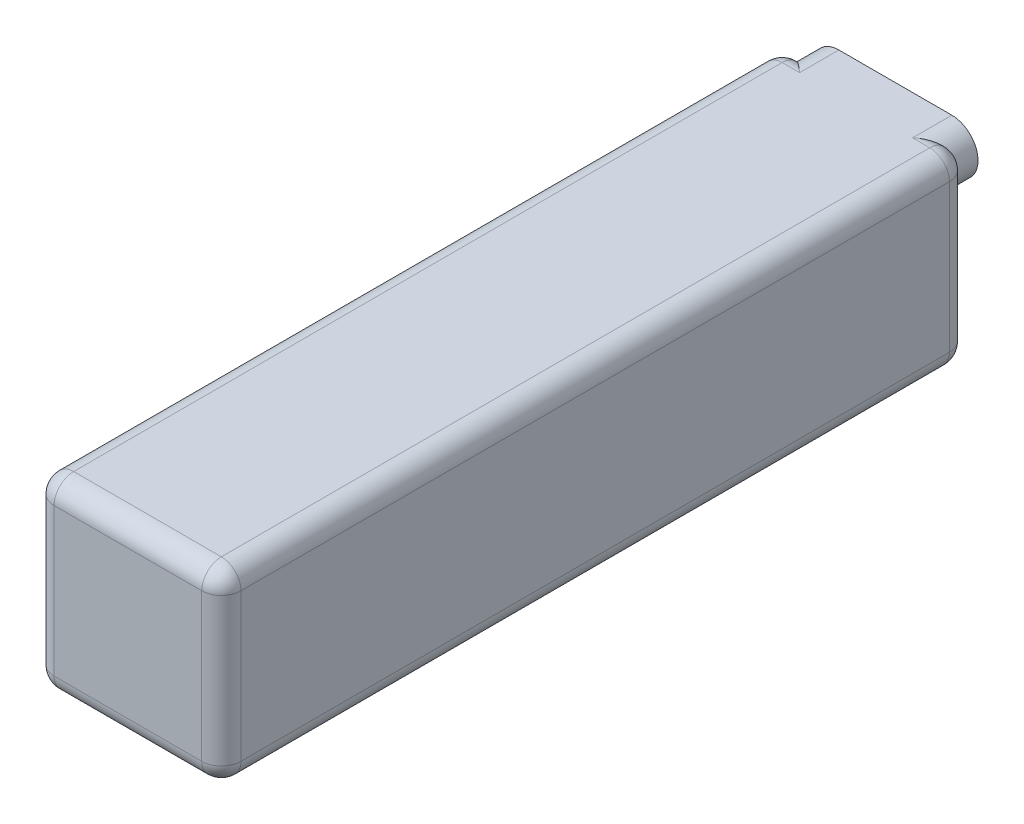
ISO-10303-21;
HEADER;
FILE_DESCRIPTION(('STEP AP214'),'2;1');
FILE_NAME('part.step','',(''),(''),'','','');
FILE_SCHEMA(('AUTOMOTIVE_DESIGN { 1 0 10303 214 1 1 1 1 }'));
ENDSEC;
DATA;
#1=APPLICATION_CONTEXT('core data for automotive mechanical design processes');
#2=APPLICATION_PROTOCOL_DEFINITION('international standard','automotive_design',2000,#1);
#3=PRODUCT_CONTEXT('',#1,'mechanical');
#4=PRODUCT('Part','Part','',(#3));
#5=PRODUCT_RELATED_PRODUCT_CATEGORY('part','',(#4));
#6=PRODUCT_DEFINITION_FORMATION('','',#4);
#7=PRODUCT_DEFINITION_CONTEXT('part definition',#1,'design');
#8=PRODUCT_DEFINITION('design','',#6,#7);
#9=PRODUCT_DEFINITION_SHAPE('','',#8);
#10=(LENGTH_UNIT() NAMED_UNIT(*) SI_UNIT(.MILLI.,.METRE.));
#11=(NAMED_UNIT(*) PLANE_ANGLE_UNIT() SI_UNIT($,.RADIAN.));
#12=(NAMED_UNIT(*) SI_UNIT($,.STERADIAN.) SOLID_ANGLE_UNIT());
#13=UNCERTAINTY_MEASURE_WITH_UNIT(LENGTH_MEASURE(1.E-05),#10,'distance_accuracy_value','');
#14=(GEOMETRIC_REPRESENTATION_CONTEXT(3) GLOBAL_UNCERTAINTY_ASSIGNED_CONTEXT((#13)) GLOBAL_UNIT_ASSIGNED_CONTEXT((#10,
#11,#12)) REPRESENTATION_CONTEXT('',''));
#15=CARTESIAN_POINT('',(0.,0.,0.));
#16=DIRECTION('',(0.,0.,1.));
#17=DIRECTION('',(1.,0.,0.));
#18=AXIS2_PLACEMENT_3D('',#15,#16,#17);
#19=CARTESIAN_POINT('',(9.525,7.525,-36.1));
#20=DIRECTION('',(-1.,0.,0.));
#21=DIRECTION('',(0.,0.,1.));
#22=AXIS2_PLACEMENT_3D('',#19,#20,#21);
#23=CYLINDRICAL_SURFACE('',#22,2.);
#24=CARTESIAN_POINT('',(7.525,8.8678567643771,-37.5821388971236));
#25=CARTESIAN_POINT('',(7.47017148830858,8.91566903286892,-37.5388018883186));
#26=CARTESIAN_POINT('',(7.4141431287502,8.96060289747981,-37.4938954286984));
#27=CARTESIAN_POINT('',(7.30014811470654,9.04486356532495,-37.4015113987563));
#28=CARTESIAN_POINT('',(7.24218355786483,9.08419620821077,-37.3540365784692));
#29=CARTESIAN_POINT('',(7.12470562884396,9.15747576152369,-37.2570275110353));
#30=CARTESIAN_POINT('',(7.06519347513015,9.19142676803975,-37.2074948667421));
#31=CARTESIAN_POINT('',(6.94487994390187,9.25416484822705,-37.1067325511129));
#32=CARTESIAN_POINT('',(6.88407807581614,9.28294991605546,-37.0555022297057));
#33=CARTESIAN_POINT('',(6.65375848806843,9.38170052472101,-36.8605363809341));
#34=CARTESIAN_POINT('',(6.48079000783268,9.43523660211648,-36.7123068380198));
#35=CARTESIAN_POINT('',(6.13170620049937,9.50660669497906,-36.4115740012556));
#36=CARTESIAN_POINT('',(5.95559399739287,9.52447435758405,-36.2590748729088));
#37=CARTESIAN_POINT('',(5.77710373823679,9.52499617982251,-36.1045075659285));
#38=CARTESIAN_POINT('',(5.7745011032655,9.52499998907685,-36.1022537587659));
#39=CARTESIAN_POINT('',(5.77189852356241,9.52500000000001,-36.1));
#40=B_SPLINE_CURVE_WITH_KNOTS('',3,(#24,#25,#26,#27,#28,#29,#30,#31,#32,#33,#34,#35,#36,#37,#38,
#39),.UNSPECIFIED.,.F.,.F.,(4,2,2,2,2,2,2,4),(0.,0.253894084387548,0.507521498157386,
0.760954933528838,1.01448656072802,1.71314600382969,2.41114606746507,2.42147467485556),.UNSPECIFIED.);
#41=CARTESIAN_POINT('',(7.525,8.8678567643771,-37.5821388971236));
#42=VERTEX_POINT('',#41);
#43=CARTESIAN_POINT('',(5.77189852356241,9.525,-36.1));
#44=VERTEX_POINT('',#43);
#45=EDGE_CURVE('E214',#42,#44,#40,.T.);
#46=ORIENTED_EDGE('',*,*,#45,.T.);
#47=DIRECTION('',(-1.,0.,0.));
#48=VECTOR('',#47,1.);
#49=CARTESIAN_POINT('',(9.525,9.525,-36.1));
#50=LINE('',#49,#48);
#51=CARTESIAN_POINT('',(7.525,9.525,-36.1));
#52=VERTEX_POINT('',#51);
#53=EDGE_CURVE('E11',#52,#44,#50,.T.);
#54=ORIENTED_EDGE('',*,*,#53,.F.);
#55=CARTESIAN_POINT('',(7.525,7.525,-36.1));
#56=DIRECTION('',(1.,0.,0.));
#57=DIRECTION('',(0.,0.,-1.));
#58=AXIS2_PLACEMENT_3D('',#55,#56,#57);
#59=CIRCLE('',#58,2.);
#60=EDGE_CURVE('E350',#52,#42,#59,.F.);
#61=ORIENTED_EDGE('',*,*,#60,.T.);
#62=EDGE_LOOP('',(#46,#54,#61));
#63=FACE_BOUND('',#62,.T.);
#64=ADVANCED_FACE('F50',(#63),#23,.T.);
#65=CARTESIAN_POINT('',(9.525,-9.525,-38.1));
#66=DIRECTION('',(0.,0.,1.));
#67=DIRECTION('',(1.,0.,0.));
#68=AXIS2_PLACEMENT_3D('',#65,#66,#67);
#69=PLANE('',#68);
#70=DIRECTION('',(-1.,0.,0.));
#71=VECTOR('',#70,1.);
#72=CARTESIAN_POINT('',(5.77189852356241,4.191,-38.1));
#73=LINE('',#72,#71);
#74=CARTESIAN_POINT('',(5.77189852356241,4.191,-38.1));
#75=VERTEX_POINT('',#74);
#76=CARTESIAN_POINT('',(-5.73974717198668,4.191,-38.1));
#77=VERTEX_POINT('',#76);
#78=EDGE_CURVE('E68',#75,#77,#73,.T.);
#79=ORIENTED_EDGE('',*,*,#78,.F.);
#80=CARTESIAN_POINT('',(5.77189852356241,6.858,-38.1));
#81=DIRECTION('',(0.,0.,-1.));
#82=DIRECTION('',(-1.,0.,0.));
#83=AXIS2_PLACEMENT_3D('',#80,#81,#82);
#84=CIRCLE('',#83,2.667);
#85=CARTESIAN_POINT('',(7.525,4.84814323562291,-38.1));
#86=VERTEX_POINT('',#85);
#87=EDGE_CURVE('E197',#86,#75,#84,.T.);
#88=ORIENTED_EDGE('',*,*,#87,.F.);
#89=DIRECTION('',(0.,1.,0.));
#90=VECTOR('',#89,1.);
#91=CARTESIAN_POINT('',(7.525,-9.525,-38.1));
#92=LINE('',#91,#90);
#93=CARTESIAN_POINT('',(7.525,-7.525,-38.1));
#94=VERTEX_POINT('',#93);
#95=EDGE_CURVE('E468',#86,#94,#92,.F.);
#96=ORIENTED_EDGE('',*,*,#95,.T.);
#97=DIRECTION('',(-1.,0.,0.));
#98=VECTOR('',#97,1.);
#99=CARTESIAN_POINT('',(9.525,-7.525,-38.1));
#100=LINE('',#99,#98);
#101=CARTESIAN_POINT('',(-7.525,-7.525,-38.1));
#102=VERTEX_POINT('',#101);
#103=EDGE_CURVE('E461',#94,#102,#100,.T.);
#104=ORIENTED_EDGE('',*,*,#103,.T.);
#105=DIRECTION('',(0.,1.,0.));
#106=VECTOR('',#105,1.);
#107=CARTESIAN_POINT('',(-7.525,9.525,-38.1));
#108=LINE('',#107,#106);
#109=CARTESIAN_POINT('',(-7.525,4.87664658880087,-38.1));
#110=VERTEX_POINT('',#109);
#111=EDGE_CURVE('E470',#102,#110,#108,.T.);
#112=ORIENTED_EDGE('',*,*,#111,.T.);
#113=CARTESIAN_POINT('',(-5.73974717198668,6.858,-38.1));
#114=DIRECTION('',(0.,0.,-1.));
#115=DIRECTION('',(-1.,0.,0.));
#116=AXIS2_PLACEMENT_3D('',#113,#114,#115);
#117=CIRCLE('',#116,2.667);
#118=EDGE_CURVE('E63',#77,#110,#117,.T.);
#119=ORIENTED_EDGE('',*,*,#118,.F.);
#120=EDGE_LOOP('',(#79,#88,#96,#104,#112,#119));
#121=FACE_BOUND('',#120,.T.);
#122=ADVANCED_FACE('F256',(#121),#69,.F.);
#123=CARTESIAN_POINT('',(9.525,9.525,38.1));
#124=DIRECTION('',(0.,-1.,0.));
#125=DIRECTION('',(0.,0.,-1.));
#126=AXIS2_PLACEMENT_3D('',#123,#124,#125);
#127=PLANE('',#126);
#128=DIRECTION('',(0.,0.,1.));
#129=VECTOR('',#128,1.);
#130=CARTESIAN_POINT('',(7.525,9.525,38.1));
#131=LINE('',#130,#129);
#132=CARTESIAN_POINT('',(7.525,9.525,36.1));
#133=VERTEX_POINT('',#132);
#134=EDGE_CURVE('E351',#133,#52,#131,.F.);
#135=ORIENTED_EDGE('',*,*,#134,.T.);
#136=ORIENTED_EDGE('',*,*,#53,.T.);
#137=DIRECTION('',(0.,0.,-1.));
#138=VECTOR('',#137,1.);
#139=CARTESIAN_POINT('',(5.77189852356241,9.52500000000001,38.102));
#140=LINE('',#139,#138);
#141=CARTESIAN_POINT('',(5.77189852356241,9.52500000000001,-40.1));
#142=VERTEX_POINT('',#141);
#143=EDGE_CURVE('E205',#44,#142,#140,.T.);
#144=ORIENTED_EDGE('',*,*,#143,.T.);
#145=DIRECTION('',(-1.,0.,0.));
#146=VECTOR('',#145,1.);
#147=CARTESIAN_POINT('',(5.77189852356241,9.52500000000001,-40.1));
#148=LINE('',#147,#146);
#149=CARTESIAN_POINT('',(-5.73974717198668,9.52500000000001,-40.1));
#150=VERTEX_POINT('',#149);
#151=EDGE_CURVE('E195',#142,#150,#148,.T.);
#152=ORIENTED_EDGE('',*,*,#151,.T.);
#153=DIRECTION('',(0.,0.,-1.));
#154=VECTOR('',#153,1.);
#155=CARTESIAN_POINT('',(-5.73974717198668,9.52500000000001,38.102));
#156=LINE('',#155,#154);
#157=CARTESIAN_POINT('',(-5.73974717198668,9.525,-36.1));
#158=VERTEX_POINT('',#157);
#159=EDGE_CURVE('E207',#158,#150,#156,.T.);
#160=ORIENTED_EDGE('',*,*,#159,.F.);
#161=CARTESIAN_POINT('',(-7.525,9.525,-36.1));
#162=VERTEX_POINT('',#161);
#163=EDGE_CURVE('E60',#158,#162,#50,.T.);
#164=ORIENTED_EDGE('',*,*,#163,.T.);
#165=DIRECTION('',(0.,0.,1.));
#166=VECTOR('',#165,1.);
#167=CARTESIAN_POINT('',(-7.525,9.525,38.1));
#168=LINE('',#167,#166);
#169=CARTESIAN_POINT('',(-7.525,9.525,36.1));
#170=VERTEX_POINT('',#169);
#171=EDGE_CURVE('E449',#162,#170,#168,.T.);
#172=ORIENTED_EDGE('',*,*,#171,.T.);
#173=DIRECTION('',(-1.,0.,0.));
#174=VECTOR('',#173,1.);
#175=CARTESIAN_POINT('',(9.525,9.525,36.1));
#176=LINE('',#175,#174);
#177=EDGE_CURVE('E358',#170,#133,#176,.F.);
#178=ORIENTED_EDGE('',*,*,#177,.T.);
#179=EDGE_LOOP('',(#135,#136,#144,#152,#160,#164,#172,#178));
#180=FACE_BOUND('',#179,.T.);
#181=ADVANCED_FACE('F253',(#180),#127,.F.);
#182=CARTESIAN_POINT('',(9.525,-9.525,38.1));
#183=DIRECTION('',(0.,0.,-1.));
#184=DIRECTION('',(-1.,0.,0.));
#185=AXIS2_PLACEMENT_3D('',#182,#183,#184);
#186=PLANE('',#185);
#187=DIRECTION('',(-1.,0.,0.));
#188=VECTOR('',#187,1.);
#189=CARTESIAN_POINT('',(9.525,7.52500000000001,38.1));
#190=LINE('',#189,#188);
#191=CARTESIAN_POINT('',(7.525,7.52500000000001,38.1));
#192=VERTEX_POINT('',#191);
#193=CARTESIAN_POINT('',(-7.525,7.52500000000001,38.1));
#194=VERTEX_POINT('',#193);
#195=EDGE_CURVE('E509',#192,#194,#190,.T.);
#196=ORIENTED_EDGE('',*,*,#195,.T.);
#197=DIRECTION('',(0.,-1.,0.));
#198=VECTOR('',#197,1.);
#199=CARTESIAN_POINT('',(-7.525,-9.525,38.1));
#200=LINE('',#199,#198);
#201=CARTESIAN_POINT('',(-7.525,-7.525,38.1));
#202=VERTEX_POINT('',#201);
#203=EDGE_CURVE('E499',#194,#202,#200,.T.);
#204=ORIENTED_EDGE('',*,*,#203,.T.);
#205=DIRECTION('',(-1.,0.,0.));
#206=VECTOR('',#205,1.);
#207=CARTESIAN_POINT('',(9.525,-7.525,38.1));
#208=LINE('',#207,#206);
#209=CARTESIAN_POINT('',(7.525,-7.525,38.1));
#210=VERTEX_POINT('',#209);
#211=EDGE_CURVE('E502',#202,#210,#208,.F.);
#212=ORIENTED_EDGE('',*,*,#211,.T.);
#213=DIRECTION('',(0.,-1.,0.));
#214=VECTOR('',#213,1.);
#215=CARTESIAN_POINT('',(7.525,-9.525,38.1));
#216=LINE('',#215,#214);
#217=EDGE_CURVE('E510',#210,#192,#216,.F.);
#218=ORIENTED_EDGE('',*,*,#217,.T.);
#219=EDGE_LOOP('',(#196,#204,#212,#218));
#220=FACE_BOUND('',#219,.T.);
#221=ADVANCED_FACE('F252',(#220),#186,.F.);
#222=CARTESIAN_POINT('',(9.525,-9.525,38.1));
#223=DIRECTION('',(0.,1.,0.));
#224=DIRECTION('',(0.,0.,1.));
#225=AXIS2_PLACEMENT_3D('',#222,#223,#224);
#226=PLANE('',#225);
#227=DIRECTION('',(0.,0.,-1.));
#228=VECTOR('',#227,1.);
#229=CARTESIAN_POINT('',(7.525,-9.525,38.1));
#230=LINE('',#229,#228);
#231=CARTESIAN_POINT('',(7.525,-9.525,-36.1));
#232=VERTEX_POINT('',#231);
#233=CARTESIAN_POINT('',(7.525,-9.525,36.1));
#234=VERTEX_POINT('',#233);
#235=EDGE_CURVE('E481',#232,#234,#230,.F.);
#236=ORIENTED_EDGE('',*,*,#235,.T.);
#237=DIRECTION('',(-1.,0.,0.));
#238=VECTOR('',#237,1.);
#239=CARTESIAN_POINT('',(9.525,-9.525,36.1));
#240=LINE('',#239,#238);
#241=CARTESIAN_POINT('',(-7.525,-9.525,36.1));
#242=VERTEX_POINT('',#241);
#243=EDGE_CURVE('E474',#234,#242,#240,.T.);
#244=ORIENTED_EDGE('',*,*,#243,.T.);
#245=DIRECTION('',(0.,0.,-1.));
#246=VECTOR('',#245,1.);
#247=CARTESIAN_POINT('',(-7.525,-9.525,-38.1));
#248=LINE('',#247,#246);
#249=CARTESIAN_POINT('',(-7.525,-9.525,-36.1));
#250=VERTEX_POINT('',#249);
#251=EDGE_CURVE('E476',#242,#250,#248,.T.);
#252=ORIENTED_EDGE('',*,*,#251,.T.);
#253=DIRECTION('',(-1.,0.,0.));
#254=VECTOR('',#253,1.);
#255=CARTESIAN_POINT('',(9.525,-9.525,-36.1));
#256=LINE('',#255,#254);
#257=EDGE_CURVE('E477',#250,#232,#256,.F.);
#258=ORIENTED_EDGE('',*,*,#257,.T.);
#259=EDGE_LOOP('',(#236,#244,#252,#258));
#260=FACE_BOUND('',#259,.T.);
#261=ADVANCED_FACE('F242',(#260),#226,.F.);
#262=CARTESIAN_POINT('',(9.525,0.,0.));
#263=DIRECTION('',(-1.,0.,0.));
#264=DIRECTION('',(0.,0.,1.));
#265=AXIS2_PLACEMENT_3D('',#262,#263,#264);
#266=PLANE('',#265);
#267=DIRECTION('',(0.,-1.,0.));
#268=VECTOR('',#267,1.);
#269=CARTESIAN_POINT('',(9.525,0.,36.1));
#270=LINE('',#269,#268);
#271=CARTESIAN_POINT('',(9.525,7.525,36.1));
#272=VERTEX_POINT('',#271);
#273=CARTESIAN_POINT('',(9.525,-7.525,36.1));
#274=VERTEX_POINT('',#273);
#275=EDGE_CURVE('E453',#272,#274,#270,.T.);
#276=ORIENTED_EDGE('',*,*,#275,.T.);
#277=DIRECTION('',(0.,0.,-1.));
#278=VECTOR('',#277,1.);
#279=CARTESIAN_POINT('',(9.525,-7.525,0.));
#280=LINE('',#279,#278);
#281=CARTESIAN_POINT('',(9.525,-7.525,-36.1));
#282=VERTEX_POINT('',#281);
#283=EDGE_CURVE('E452',#274,#282,#280,.T.);
#284=ORIENTED_EDGE('',*,*,#283,.T.);
#285=DIRECTION('',(0.,1.,0.));
#286=VECTOR('',#285,1.);
#287=CARTESIAN_POINT('',(9.525,0.,-36.1));
#288=LINE('',#287,#286);
#289=CARTESIAN_POINT('',(9.525,7.525,-36.1));
#290=VERTEX_POINT('',#289);
#291=EDGE_CURVE('E460',#282,#290,#288,.T.);
#292=ORIENTED_EDGE('',*,*,#291,.T.);
#293=DIRECTION('',(0.,0.,1.));
#294=VECTOR('',#293,1.);
#295=CARTESIAN_POINT('',(9.525,7.525,0.));
#296=LINE('',#295,#294);
#297=EDGE_CURVE('E364',#290,#272,#296,.T.);
#298=ORIENTED_EDGE('',*,*,#297,.T.);
#299=EDGE_LOOP('',(#276,#284,#292,#298));
#300=FACE_BOUND('',#299,.T.);
#301=ADVANCED_FACE('F239',(#300),#266,.F.);
#302=CARTESIAN_POINT('',(-9.525,0.,0.));
#303=DIRECTION('',(-1.,0.,0.));
#304=DIRECTION('',(0.,0.,1.));
#305=AXIS2_PLACEMENT_3D('',#302,#303,#304);
#306=PLANE('',#305);
#307=DIRECTION('',(0.,0.,-1.));
#308=VECTOR('',#307,1.);
#309=CARTESIAN_POINT('',(-9.525,-7.525,38.1));
#310=LINE('',#309,#308);
#311=CARTESIAN_POINT('',(-9.525,-7.525,-36.1));
#312=VERTEX_POINT('',#311);
#313=CARTESIAN_POINT('',(-9.525,-7.525,36.1));
#314=VERTEX_POINT('',#313);
#315=EDGE_CURVE('E489',#312,#314,#310,.F.);
#316=ORIENTED_EDGE('',*,*,#315,.T.);
#317=DIRECTION('',(0.,-1.,0.));
#318=VECTOR('',#317,1.);
#319=CARTESIAN_POINT('',(-9.525,9.525,36.1));
#320=LINE('',#319,#318);
#321=CARTESIAN_POINT('',(-9.525,7.525,36.1));
#322=VERTEX_POINT('',#321);
#323=EDGE_CURVE('E488',#314,#322,#320,.F.);
#324=ORIENTED_EDGE('',*,*,#323,.T.);
#325=DIRECTION('',(0.,0.,1.));
#326=VECTOR('',#325,1.);
#327=CARTESIAN_POINT('',(-9.525,7.525,-38.1));
#328=LINE('',#327,#326);
#329=CARTESIAN_POINT('',(-9.525,7.525,-36.1));
#330=VERTEX_POINT('',#329);
#331=EDGE_CURVE('E496',#322,#330,#328,.F.);
#332=ORIENTED_EDGE('',*,*,#331,.T.);
#333=DIRECTION('',(0.,1.,0.));
#334=VECTOR('',#333,1.);
#335=CARTESIAN_POINT('',(-9.525,-9.525,-36.1));
#336=LINE('',#335,#334);
#337=EDGE_CURVE('E491',#330,#312,#336,.F.);
#338=ORIENTED_EDGE('',*,*,#337,.T.);
#339=EDGE_LOOP('',(#316,#324,#332,#338));
#340=FACE_BOUND('',#339,.T.);
#341=ADVANCED_FACE('F243',(#340),#306,.T.);
#342=CARTESIAN_POINT('',(7.525,0.,-36.1));
#343=DIRECTION('',(0.,1.,0.));
#344=DIRECTION('',(0.,0.,1.));
#345=AXIS2_PLACEMENT_3D('',#342,#343,#344);
#346=CYLINDRICAL_SURFACE('',#345,2.);
#347=CARTESIAN_POINT('',(7.525,4.84814323562291,-38.1));
#348=CARTESIAN_POINT('',(7.57809983773724,4.89445255026939,-38.0999968456456));
#349=CARTESIAN_POINT('',(7.62929791089541,4.94282301357113,-38.0978864790573));
#350=CARTESIAN_POINT('',(7.72753902676778,5.04325971991175,-38.0903275441777));
#351=CARTESIAN_POINT('',(7.77458735202535,5.09532110753829,-38.0848832921223));
#352=CARTESIAN_POINT('',(7.90891604245871,5.25627451929506,-38.0648901684079));
#353=CARTESIAN_POINT('',(7.98969606140605,5.37021280723207,-38.0466706010332));
#354=CARTESIAN_POINT('',(8.13202209372824,5.60823460064113,-38.0070834406751));
#355=CARTESIAN_POINT('',(8.19364125341418,5.73227718475984,-37.9857282893803));
#356=CARTESIAN_POINT('',(8.29712508144791,5.98896698374558,-37.9457851281109));
#357=CARTESIAN_POINT('',(8.33898268952636,6.12161725468362,-37.9271981087363));
#358=CARTESIAN_POINT('',(8.38732407743885,6.33059688115255,-37.9046428249551));
#359=CARTESIAN_POINT('',(8.40123235051337,6.40497395665638,-37.8978751982149));
#360=CARTESIAN_POINT('',(8.42269675811989,6.55487697637545,-37.8872573684075));
#361=CARTESIAN_POINT('',(8.43025221378266,6.63040304249539,-37.8834074771373));
#362=CARTESIAN_POINT('',(8.43888900350349,6.78184463968138,-37.8789969401217));
#363=CARTESIAN_POINT('',(8.43997658647292,6.85775972388422,-37.8784331195618));
#364=CARTESIAN_POINT('',(8.43568024772754,7.009327050103,-37.8806365810574));
#365=CARTESIAN_POINT('',(8.4302992994807,7.08497939686744,-37.8834023325691));
#366=CARTESIAN_POINT('',(8.41469028706175,7.22186533885725,-37.8912325967541));
#367=CARTESIAN_POINT('',(8.40550517680888,7.28325046216698,-37.8957956011295));
#368=CARTESIAN_POINT('',(8.38294212999765,7.40496332469863,-37.9066759139901));
#369=CARTESIAN_POINT('',(8.36957247444659,7.4652929059394,-37.9129897548672));
#370=CARTESIAN_POINT('',(8.35414560701512,7.525,-37.9200322970672));
#371=B_SPLINE_CURVE_WITH_KNOTS('',3,(#347,#348,#349,#350,#351,#352,#353,#354,#355,#356,#357,
#358,#359,#360,#361,#362,#363,#364,#365,#366,#367,#368,#369,#370),.UNSPECIFIED.,.F.,.F.,(4,2,2,
2,2,2,2,2,2,2,2,4),(0.,0.211155398353922,0.422037999305912,0.842559881307541,1.26145613914824,
1.680501944278,1.90812736132653,2.1357770995941,2.36320685912737,2.59053211323798,
2.7770685443075,2.96323813849872),.UNSPECIFIED.);
#372=CARTESIAN_POINT('',(8.35414560701512,7.525,-37.9200322970672));
#373=VERTEX_POINT('',#372);
#374=EDGE_CURVE('E534',#86,#373,#371,.T.);
#375=ORIENTED_EDGE('',*,*,#374,.T.);
#376=CARTESIAN_POINT('',(7.525,7.525,-36.1));
#377=DIRECTION('',(0.,1.,0.));
#378=DIRECTION('',(0.,0.,1.));
#379=AXIS2_PLACEMENT_3D('',#376,#377,#378);
#380=CIRCLE('',#379,2.);
#381=EDGE_CURVE('E51',#290,#373,#380,.T.);
#382=ORIENTED_EDGE('',*,*,#381,.F.);
#383=ORIENTED_EDGE('',*,*,#291,.F.);
#384=CARTESIAN_POINT('',(7.525,-7.525,-36.1));
#385=DIRECTION('',(0.,-1.,0.));
#386=DIRECTION('',(0.,0.,-1.));
#387=AXIS2_PLACEMENT_3D('',#384,#385,#386);
#388=CIRCLE('',#387,2.);
#389=EDGE_CURVE('E369',#94,#282,#388,.T.);
#390=ORIENTED_EDGE('',*,*,#389,.F.);
#391=ORIENTED_EDGE('',*,*,#95,.F.);
#392=EDGE_LOOP('',(#375,#382,#383,#390,#391));
#393=FACE_BOUND('',#392,.T.);
#394=ADVANCED_FACE('F47',(#393),#346,.T.);
#395=CARTESIAN_POINT('',(7.525,7.525,-36.1));
#396=DIRECTION('',(0.,0.,-1.));
#397=DIRECTION('',(-1.,0.,0.));
#398=AXIS2_PLACEMENT_3D('',#395,#396,#397);
#399=SPHERICAL_SURFACE('',#398,2.);
#400=CARTESIAN_POINT('',(8.35419725918539,7.5248,-37.9200087541986));
#401=CARTESIAN_POINT('',(8.34105064297131,7.57575203185397,-37.9260094230288));
#402=CARTESIAN_POINT('',(8.32633175981581,7.62648587496162,-37.9304037387649));
#403=CARTESIAN_POINT('',(8.29385324955935,7.72714694667371,-37.9359740598213));
#404=CARTESIAN_POINT('',(8.27609381915016,7.77707422722587,-37.9371502732358));
#405=CARTESIAN_POINT('',(8.23768032465634,7.87564559364182,-37.9362805601438));
#406=CARTESIAN_POINT('',(8.2170329844719,7.92429235692661,-37.9342420083928));
#407=CARTESIAN_POINT('',(8.17299727812488,8.02006569798943,-37.9269657932935));
#408=CARTESIAN_POINT('',(8.14960900645743,8.06719232810349,-37.9217282402064));
#409=CARTESIAN_POINT('',(8.07560959678889,8.20586757724425,-37.9012202909321));
#410=CARTESIAN_POINT('',(8.02115323568723,8.29473864463286,-37.8811543657318));
#411=CARTESIAN_POINT('',(7.90436414537428,8.46298502955698,-37.8284252622849));
#412=CARTESIAN_POINT('',(7.84203306693759,8.54236233049841,-37.7957647213071));
#413=CARTESIAN_POINT('',(7.7365412752332,8.66268519839102,-37.7325854446109));
#414=CARTESIAN_POINT('',(7.69486759349583,8.70694829104302,-37.7057837744504));
#415=CARTESIAN_POINT('',(7.61045235721061,8.79091651184007,-37.6474319850611));
#416=CARTESIAN_POINT('',(7.56771283182,8.83062959954738,-37.6158903882719));
#417=CARTESIAN_POINT('',(7.5248,8.86803119724619,-37.5819808241754));
#418=B_SPLINE_CURVE_WITH_KNOTS('',3,(#400,#401,#402,#403,#404,#405,#406,#407,#408,#409,#410,
#411,#412,#413,#414,#415,#416,#417),.UNSPECIFIED.,.F.,.F.,(4,2,2,2,2,2,2,2,4),(0.,
0.158834751294521,0.317659231512949,0.476119893900426,0.634575094875353,0.95139931216228,
1.26815722354655,1.4671652716324,1.66581969009695),.UNSPECIFIED.);
#419=EDGE_CURVE('E222',#373,#42,#418,.T.);
#420=ORIENTED_EDGE('',*,*,#419,.T.);
#421=ORIENTED_EDGE('',*,*,#60,.F.);
#422=CARTESIAN_POINT('',(7.525,7.525,-36.1));
#423=DIRECTION('',(0.,0.,-1.));
#424=DIRECTION('',(-1.,0.,0.));
#425=AXIS2_PLACEMENT_3D('',#422,#423,#424);
#426=CIRCLE('',#425,2.);
#427=EDGE_CURVE('E361',#290,#52,#426,.F.);
#428=ORIENTED_EDGE('',*,*,#427,.F.);
#429=ORIENTED_EDGE('',*,*,#381,.T.);
#430=EDGE_LOOP('',(#420,#421,#428,#429));
#431=FACE_BOUND('',#430,.T.);
#432=ADVANCED_FACE('F331',(#431),#399,.T.);
#433=CARTESIAN_POINT('',(7.525,-7.525,-36.1));
#434=DIRECTION('',(1.,0.,0.));
#435=DIRECTION('',(0.,0.,-1.));
#436=AXIS2_PLACEMENT_3D('',#433,#434,#435);
#437=SPHERICAL_SURFACE('',#436,2.);
#438=CARTESIAN_POINT('',(7.525,-7.525,-36.1));
#439=DIRECTION('',(1.,0.,0.));
#440=DIRECTION('',(0.,0.,-1.));
#441=AXIS2_PLACEMENT_3D('',#438,#439,#440);
#442=CIRCLE('',#441,2.);
#443=EDGE_CURVE('E380',#94,#232,#442,.F.);
#444=ORIENTED_EDGE('',*,*,#443,.F.);
#445=ORIENTED_EDGE('',*,*,#389,.T.);
#446=CARTESIAN_POINT('',(7.525,-7.525,-36.1));
#447=DIRECTION('',(0.,0.,-1.));
#448=DIRECTION('',(-1.,0.,0.));
#449=AXIS2_PLACEMENT_3D('',#446,#447,#448);
#450=CIRCLE('',#449,2.);
#451=EDGE_CURVE('E370',#232,#282,#450,.F.);
#452=ORIENTED_EDGE('',*,*,#451,.F.);
#453=EDGE_LOOP('',(#444,#445,#452));
#454=FACE_BOUND('',#453,.T.);
#455=ADVANCED_FACE('F327',(#454),#437,.T.);
#456=CARTESIAN_POINT('',(-7.525,8.83935341119914,-37.6074730878093));
#457=CARTESIAN_POINT('',(-7.4706354556935,8.88832505692359,-37.5647569994042));
#458=CARTESIAN_POINT('',(-7.41501818468024,8.93439754404638,-37.5204041184862));
#459=CARTESIAN_POINT('',(-7.30176126907389,9.02088790298116,-37.4290169927899));
#460=CARTESIAN_POINT('',(-7.24412396792768,9.06131207246036,-37.3819858179423));
#461=CARTESIAN_POINT('',(-7.12723601268818,9.13672643119169,-37.2857770531643));
#462=CARTESIAN_POINT('',(-7.06798678159995,9.17172124150219,-37.2366013346911));
#463=CARTESIAN_POINT('',(-6.94813335015186,9.23651549753052,-37.1364716061447));
#464=CARTESIAN_POINT('',(-6.88752858845447,9.26631274420477,-37.0855168542676));
#465=CARTESIAN_POINT('',(-6.73914601920015,9.33251315601556,-36.9601418759039));
#466=CARTESIAN_POINT('',(-6.65081045862275,9.36630787770035,-36.8849884504755));
#467=CARTESIAN_POINT('',(-6.47266627120919,9.42402734201275,-36.7327183066172));
#468=CARTESIAN_POINT('',(-6.38285711067057,9.44794842277155,-36.6556008710261));
#469=CARTESIAN_POINT('',(-6.11215831869508,9.50529577445246,-36.4224926777627));
#470=CARTESIAN_POINT('',(-5.92965227383565,9.52445581392384,-36.2644522994764));
#471=CARTESIAN_POINT('',(-5.74495235185327,9.52499618549291,-36.1045075347624));
#472=CARTESIAN_POINT('',(-5.74234971641118,9.52499999482203,-36.1022537271769));
#473=CARTESIAN_POINT('',(-5.73974717198668,9.52500000000001,-36.1));
#474=B_SPLINE_CURVE_WITH_KNOTS('',3,(#456,#457,#458,#459,#460,#461,#462,#463,#464,#465,#466,
#467,#468,#469,#470,#471,#472,#473),.UNSPECIFIED.,.F.,.F.,(4,2,2,2,2,2,2,2,4),(0.,
0.254033400323945,0.507781263148792,0.761311956042799,1.01494965673204,1.37684040547708,
1.73886524946668,2.4614982123363,2.47182681972679),.UNSPECIFIED.);
#475=CARTESIAN_POINT('',(-7.525,8.83935341119914,-37.6074730878093));
#476=VERTEX_POINT('',#475);
#477=EDGE_CURVE('E224',#158,#476,#474,.F.);
#478=ORIENTED_EDGE('',*,*,#477,.T.);
#479=CARTESIAN_POINT('',(-7.525,7.525,-36.1));
#480=DIRECTION('',(-1.,0.,0.));
#481=DIRECTION('',(0.,0.,1.));
#482=AXIS2_PLACEMENT_3D('',#479,#480,#481);
#483=CIRCLE('',#482,2.);
#484=EDGE_CURVE('E381',#162,#476,#483,.T.);
#485=ORIENTED_EDGE('',*,*,#484,.F.);
#486=ORIENTED_EDGE('',*,*,#163,.F.);
#487=EDGE_LOOP('',(#478,#485,#486));
#488=FACE_BOUND('',#487,.T.);
#489=ADVANCED_FACE('F329',(#488),#23,.T.);
#490=CARTESIAN_POINT('',(7.525,7.525,0.));
#491=DIRECTION('',(0.,0.,1.));
#492=DIRECTION('',(1.,0.,0.));
#493=AXIS2_PLACEMENT_3D('',#490,#491,#492);
#494=CYLINDRICAL_SURFACE('',#493,2.);
#495=ORIENTED_EDGE('',*,*,#427,.T.);
#496=ORIENTED_EDGE('',*,*,#134,.F.);
#497=CARTESIAN_POINT('',(7.525,7.525,36.1));
#498=DIRECTION('',(0.,0.,1.));
#499=DIRECTION('',(1.,0.,0.));
#500=AXIS2_PLACEMENT_3D('',#497,#498,#499);
#501=CIRCLE('',#500,2.);
#502=EDGE_CURVE('E390',#272,#133,#501,.T.);
#503=ORIENTED_EDGE('',*,*,#502,.F.);
#504=ORIENTED_EDGE('',*,*,#297,.F.);
#505=EDGE_LOOP('',(#495,#496,#503,#504));
#506=FACE_BOUND('',#505,.T.);
#507=ADVANCED_FACE('F325',(#506),#494,.T.);
#508=CARTESIAN_POINT('',(7.525,0.,36.1));
#509=DIRECTION('',(0.,-1.,0.));
#510=DIRECTION('',(0.,0.,-1.));
#511=AXIS2_PLACEMENT_3D('',#508,#509,#510);
#512=CYLINDRICAL_SURFACE('',#511,2.);
#513=CARTESIAN_POINT('',(7.525,-7.525,36.1));
#514=DIRECTION('',(0.,-1.,0.));
#515=DIRECTION('',(0.,0.,-1.));
#516=AXIS2_PLACEMENT_3D('',#513,#514,#515);
#517=CIRCLE('',#516,2.);
#518=EDGE_CURVE('E393',#274,#210,#517,.T.);
#519=ORIENTED_EDGE('',*,*,#518,.F.);
#520=ORIENTED_EDGE('',*,*,#275,.F.);
#521=CARTESIAN_POINT('',(7.525,7.52500000000001,36.1));
#522=DIRECTION('',(0.,1.,0.));
#523=DIRECTION('',(-1.,0.,0.));
#524=AXIS2_PLACEMENT_3D('',#521,#522,#523);
#525=CIRCLE('',#524,2.);
#526=EDGE_CURVE('E388',#192,#272,#525,.T.);
#527=ORIENTED_EDGE('',*,*,#526,.F.);
#528=ORIENTED_EDGE('',*,*,#217,.F.);
#529=EDGE_LOOP('',(#519,#520,#527,#528));
#530=FACE_BOUND('',#529,.T.);
#531=ADVANCED_FACE('F319',(#530),#512,.T.);
#532=CARTESIAN_POINT('',(7.525,-7.525,0.));
#533=DIRECTION('',(0.,0.,-1.));
#534=DIRECTION('',(-1.,0.,0.));
#535=AXIS2_PLACEMENT_3D('',#532,#533,#534);
#536=CYLINDRICAL_SURFACE('',#535,2.);
#537=ORIENTED_EDGE('',*,*,#451,.T.);
#538=ORIENTED_EDGE('',*,*,#283,.F.);
#539=CARTESIAN_POINT('',(7.525,-7.525,36.1));
#540=DIRECTION('',(0.,0.,1.));
#541=DIRECTION('',(1.,0.,0.));
#542=AXIS2_PLACEMENT_3D('',#539,#540,#541);
#543=CIRCLE('',#542,2.);
#544=EDGE_CURVE('E396',#234,#274,#543,.T.);
#545=ORIENTED_EDGE('',*,*,#544,.F.);
#546=ORIENTED_EDGE('',*,*,#235,.F.);
#547=EDGE_LOOP('',(#537,#538,#545,#546));
#548=FACE_BOUND('',#547,.T.);
#549=ADVANCED_FACE('F313',(#548),#536,.T.);
#550=CARTESIAN_POINT('',(9.525,-7.525,-36.1));
#551=DIRECTION('',(-1.,0.,0.));
#552=DIRECTION('',(0.,0.,1.));
#553=AXIS2_PLACEMENT_3D('',#550,#551,#552);
#554=CYLINDRICAL_SURFACE('',#553,2.);
#555=ORIENTED_EDGE('',*,*,#443,.T.);
#556=ORIENTED_EDGE('',*,*,#257,.F.);
#557=CARTESIAN_POINT('',(-7.525,-7.525,-36.1));
#558=DIRECTION('',(-1.,0.,0.));
#559=DIRECTION('',(0.,0.,1.));
#560=AXIS2_PLACEMENT_3D('',#557,#558,#559);
#561=CIRCLE('',#560,2.);
#562=EDGE_CURVE('E405',#102,#250,#561,.T.);
#563=ORIENTED_EDGE('',*,*,#562,.F.);
#564=ORIENTED_EDGE('',*,*,#103,.F.);
#565=EDGE_LOOP('',(#555,#556,#563,#564));
#566=FACE_BOUND('',#565,.T.);
#567=ADVANCED_FACE('F309',(#566),#554,.T.);
#568=CARTESIAN_POINT('',(-7.525,-9.525,-36.1));
#569=DIRECTION('',(0.,-1.,0.));
#570=DIRECTION('',(0.,0.,-1.));
#571=AXIS2_PLACEMENT_3D('',#568,#569,#570);
#572=CYLINDRICAL_SURFACE('',#571,2.);
#573=CARTESIAN_POINT('',(-8.32199425543938,7.52500000000001,-37.934339160787));
#574=CARTESIAN_POINT('',(-8.33912922001698,7.45869532846077,-37.9268707288042));
#575=CARTESIAN_POINT('',(-8.35372191863621,7.3916220597086,-37.9202667662189));
#576=CARTESIAN_POINT('',(-8.37771975931434,7.25636785229612,-37.9091620999921));
#577=CARTESIAN_POINT('',(-8.3871236690704,7.18818665446457,-37.904661896018));
#578=CARTESIAN_POINT('',(-8.40059669853241,7.05154285205726,-37.8981603289249));
#579=CARTESIAN_POINT('',(-8.40469396314199,6.98308368002439,-37.8961457853051));
#580=CARTESIAN_POINT('',(-8.40760072851127,6.84603772345718,-37.8947200461213));
#581=CARTESIAN_POINT('',(-8.40641106642414,6.77745096084513,-37.8953084383979));
#582=CARTESIAN_POINT('',(-8.39875259422271,6.64055183564922,-37.8990483225679));
#583=CARTESIAN_POINT('',(-8.3922769385375,6.5722399443838,-37.9022031380627));
#584=CARTESIAN_POINT('',(-8.37411355628493,6.43645170991499,-37.9108293374411));
#585=CARTESIAN_POINT('',(-8.3624237464709,6.36897571176744,-37.9163016472047));
#586=CARTESIAN_POINT('',(-8.31964847356664,6.16829747593768,-37.9356313138578));
#587=CARTESIAN_POINT('',(-8.28086265194091,6.03694004839217,-37.9523978880496));
#588=CARTESIAN_POINT('',(-8.18221155280523,5.77760901874493,-37.9896901812531));
#589=CARTESIAN_POINT('',(-8.12164148404575,5.64992481004783,-38.0103289688319));
#590=CARTESIAN_POINT('',(-7.98095924079099,5.40554070727058,-38.0486905680991));
#591=CARTESIAN_POINT('',(-7.9008913857601,5.28881672224679,-38.0664198423886));
#592=CARTESIAN_POINT('',(-7.76818304636611,5.12503900139355,-38.0856499355731));
#593=CARTESIAN_POINT('',(-7.72236747920002,5.07280171948599,-38.0908163185551));
#594=CARTESIAN_POINT('',(-7.62666602156103,4.97192837501548,-38.0979903907933));
#595=CARTESIAN_POINT('',(-7.57677823177731,4.9232940132833,-38.0999965971663));
#596=CARTESIAN_POINT('',(-7.525,4.87664658880087,-38.1));
#597=B_SPLINE_CURVE_WITH_KNOTS('',3,(#573,#574,#575,#576,#577,#578,#579,#580,#581,#582,#583,
#584,#585,#586,#587,#588,#589,#590,#591,#592,#593,#594,#595,#596),.UNSPECIFIED.,.F.,.F.,(4,2,2,
2,2,2,2,2,2,2,2,4),(0.,0.206632027657119,0.413313107947384,0.618893461434149,0.824441263663495,
1.03025568154129,1.23615240362075,1.64822818018315,2.07505303172254,2.50091659914556,
2.70969006431676,2.91856146533216),.UNSPECIFIED.);
#598=CARTESIAN_POINT('',(-8.32199425543938,7.525,-37.934339160787));
#599=VERTEX_POINT('',#598);
#600=EDGE_CURVE('E221',#599,#110,#597,.T.);
#601=ORIENTED_EDGE('',*,*,#600,.T.);
#602=ORIENTED_EDGE('',*,*,#111,.F.);
#603=CARTESIAN_POINT('',(-7.525,-7.525,-36.1));
#604=DIRECTION('',(0.,-1.,0.));
#605=DIRECTION('',(0.,0.,-1.));
#606=AXIS2_PLACEMENT_3D('',#603,#604,#605);
#607=CIRCLE('',#606,2.);
#608=EDGE_CURVE('E407',#312,#102,#607,.T.);
#609=ORIENTED_EDGE('',*,*,#608,.F.);
#610=ORIENTED_EDGE('',*,*,#337,.F.);
#611=CARTESIAN_POINT('',(-7.525,7.525,-36.1));
#612=DIRECTION('',(0.,1.,0.));
#613=DIRECTION('',(0.,0.,1.));
#614=AXIS2_PLACEMENT_3D('',#611,#612,#613);
#615=CIRCLE('',#614,2.);
#616=EDGE_CURVE('E382',#599,#330,#615,.T.);
#617=ORIENTED_EDGE('',*,*,#616,.F.);
#618=EDGE_LOOP('',(#601,#602,#609,#610,#617));
#619=FACE_BOUND('',#618,.T.);
#620=ADVANCED_FACE('F306',(#619),#572,.T.);
#621=CARTESIAN_POINT('',(-7.525,7.525,-36.1));
#622=DIRECTION('',(0.,0.,-1.));
#623=DIRECTION('',(-1.,0.,0.));
#624=AXIS2_PLACEMENT_3D('',#621,#622,#623);
#625=SPHERICAL_SURFACE('',#624,2.);
#626=CARTESIAN_POINT('',(-7.5248,8.8395335983025,-37.6073159519271));
#627=CARTESIAN_POINT('',(-7.55962598812409,8.80817303375696,-37.6346767337664));
#628=CARTESIAN_POINT('',(-7.5943035988129,8.7752592589887,-37.6604482147026));
#629=CARTESIAN_POINT('',(-7.6629169703928,8.70642003728096,-37.7087781022029));
#630=CARTESIAN_POINT('',(-7.69685258059966,8.6704939856451,-37.7313358611667));
#631=CARTESIAN_POINT('',(-7.76357098917474,8.59568326462144,-37.7732232462859));
#632=CARTESIAN_POINT('',(-7.79635203797316,8.55679436562083,-37.7925481267367));
#633=CARTESIAN_POINT('',(-7.86028183578318,8.47629190814546,-37.8278852047967));
#634=CARTESIAN_POINT('',(-7.89143076129283,8.43467864538315,-37.8438977611554));
#635=CARTESIAN_POINT('',(-7.98197276277974,8.3058616975106,-37.8869703995187));
#636=CARTESIAN_POINT('',(-8.03837854041758,8.21477209947261,-37.9090146337961));
#637=CARTESIAN_POINT('',(-8.14036514959603,8.02483873695238,-37.93937731389));
#638=CARTESIAN_POINT('',(-8.18596944623499,7.92601241331837,-37.9477257508153));
#639=CARTESIAN_POINT('',(-8.24445078745517,7.77568222777181,-37.9499551872674));
#640=CARTESIAN_POINT('',(-8.26208694133268,7.72601860893386,-37.9490727135561));
#641=CARTESIAN_POINT('',(-8.29434250314827,7.62591720397286,-37.9440973472655));
#642=CARTESIAN_POINT('',(-8.30896400059455,7.57547998027611,-37.9400066878439));
#643=CARTESIAN_POINT('',(-8.32204590760965,7.5248,-37.9343167068864));
#644=B_SPLINE_CURVE_WITH_KNOTS('',3,(#626,#627,#628,#629,#630,#631,#632,#633,#634,#635,#636,
#637,#638,#639,#640,#641,#642,#643),.UNSPECIFIED.,.F.,.F.,(4,2,2,2,2,2,2,2,4),(0.,
0.162757959101259,0.325548669464563,0.488576290524162,0.651586245212264,0.978000309466971,
1.30369863220136,1.46166172570511,1.61951496155993),.UNSPECIFIED.);
#645=EDGE_CURVE('E211',#476,#599,#644,.T.);
#646=ORIENTED_EDGE('',*,*,#645,.T.);
#647=ORIENTED_EDGE('',*,*,#616,.T.);
#648=CARTESIAN_POINT('',(-7.525,7.525,-36.1));
#649=DIRECTION('',(0.,0.,-1.));
#650=DIRECTION('',(-1.,0.,0.));
#651=AXIS2_PLACEMENT_3D('',#648,#649,#650);
#652=CIRCLE('',#651,2.);
#653=EDGE_CURVE('E406',#162,#330,#652,.F.);
#654=ORIENTED_EDGE('',*,*,#653,.F.);
#655=ORIENTED_EDGE('',*,*,#484,.T.);
#656=EDGE_LOOP('',(#646,#647,#654,#655));
#657=FACE_BOUND('',#656,.T.);
#658=ADVANCED_FACE('F305',(#657),#625,.T.);
#659=CARTESIAN_POINT('',(7.525,7.525,36.1));
#660=DIRECTION('',(1.,0.,0.));
#661=DIRECTION('',(0.,0.,-1.));
#662=AXIS2_PLACEMENT_3D('',#659,#660,#661);
#663=SPHERICAL_SURFACE('',#662,2.);
#664=ORIENTED_EDGE('',*,*,#526,.T.);
#665=ORIENTED_EDGE('',*,*,#502,.T.);
#666=CARTESIAN_POINT('',(7.525,7.525,36.1));
#667=DIRECTION('',(1.,0.,0.));
#668=DIRECTION('',(0.,0.,-1.));
#669=AXIS2_PLACEMENT_3D('',#666,#667,#668);
#670=CIRCLE('',#669,2.);
#671=EDGE_CURVE('E415',#192,#133,#670,.F.);
#672=ORIENTED_EDGE('',*,*,#671,.F.);
#673=EDGE_LOOP('',(#664,#665,#672));
#674=FACE_BOUND('',#673,.T.);
#675=ADVANCED_FACE('F296',(#674),#663,.T.);
#676=CARTESIAN_POINT('',(7.525,-7.525,36.1));
#677=DIRECTION('',(1.,0.,0.));
#678=DIRECTION('',(0.,0.,-1.));
#679=AXIS2_PLACEMENT_3D('',#676,#677,#678);
#680=SPHERICAL_SURFACE('',#679,2.);
#681=ORIENTED_EDGE('',*,*,#544,.T.);
#682=ORIENTED_EDGE('',*,*,#518,.T.);
#683=CARTESIAN_POINT('',(7.525,-7.525,36.1));
#684=DIRECTION('',(1.,0.,0.));
#685=DIRECTION('',(0.,0.,-1.));
#686=AXIS2_PLACEMENT_3D('',#683,#684,#685);
#687=CIRCLE('',#686,2.);
#688=EDGE_CURVE('E420',#234,#210,#687,.F.);
#689=ORIENTED_EDGE('',*,*,#688,.F.);
#690=EDGE_LOOP('',(#681,#682,#689));
#691=FACE_BOUND('',#690,.T.);
#692=ADVANCED_FACE('F295',(#691),#680,.T.);
#693=CARTESIAN_POINT('',(-7.525,-7.525,-36.1));
#694=DIRECTION('',(0.,0.,-1.));
#695=DIRECTION('',(-1.,0.,0.));
#696=AXIS2_PLACEMENT_3D('',#693,#694,#695);
#697=SPHERICAL_SURFACE('',#696,2.);
#698=ORIENTED_EDGE('',*,*,#608,.T.);
#699=ORIENTED_EDGE('',*,*,#562,.T.);
#700=CARTESIAN_POINT('',(-7.525,-7.525,-36.1));
#701=DIRECTION('',(0.,0.,-1.));
#702=DIRECTION('',(-1.,0.,0.));
#703=AXIS2_PLACEMENT_3D('',#700,#701,#702);
#704=CIRCLE('',#703,2.);
#705=EDGE_CURVE('E423',#312,#250,#704,.F.);
#706=ORIENTED_EDGE('',*,*,#705,.F.);
#707=EDGE_LOOP('',(#698,#699,#706));
#708=FACE_BOUND('',#707,.T.);
#709=ADVANCED_FACE('F287',(#708),#697,.T.);
#710=CARTESIAN_POINT('',(-7.525,7.525,38.1));
#711=DIRECTION('',(0.,0.,-1.));
#712=DIRECTION('',(-1.,0.,0.));
#713=AXIS2_PLACEMENT_3D('',#710,#711,#712);
#714=CYLINDRICAL_SURFACE('',#713,2.);
#715=ORIENTED_EDGE('',*,*,#653,.T.);
#716=ORIENTED_EDGE('',*,*,#331,.F.);
#717=CARTESIAN_POINT('',(-7.525,7.525,36.1));
#718=DIRECTION('',(0.,0.,1.));
#719=DIRECTION('',(1.,0.,0.));
#720=AXIS2_PLACEMENT_3D('',#717,#718,#719);
#721=CIRCLE('',#720,2.);
#722=EDGE_CURVE('E424',#170,#322,#721,.T.);
#723=ORIENTED_EDGE('',*,*,#722,.F.);
#724=ORIENTED_EDGE('',*,*,#171,.F.);
#725=EDGE_LOOP('',(#715,#716,#723,#724));
#726=FACE_BOUND('',#725,.T.);
#727=ADVANCED_FACE('F288',(#726),#714,.T.);
#728=CARTESIAN_POINT('',(9.525,7.52500000000001,36.1));
#729=DIRECTION('',(-1.,0.,0.));
#730=DIRECTION('',(0.,0.,1.));
#731=AXIS2_PLACEMENT_3D('',#728,#729,#730);
#732=CYLINDRICAL_SURFACE('',#731,2.);
#733=ORIENTED_EDGE('',*,*,#671,.T.);
#734=ORIENTED_EDGE('',*,*,#177,.F.);
#735=CARTESIAN_POINT('',(-7.525,7.52500000000001,36.1));
#736=DIRECTION('',(-1.,0.,0.));
#737=DIRECTION('',(0.,0.,1.));
#738=AXIS2_PLACEMENT_3D('',#735,#736,#737);
#739=CIRCLE('',#738,2.);
#740=EDGE_CURVE('E429',#194,#170,#739,.T.);
#741=ORIENTED_EDGE('',*,*,#740,.F.);
#742=ORIENTED_EDGE('',*,*,#195,.F.);
#743=EDGE_LOOP('',(#733,#734,#741,#742));
#744=FACE_BOUND('',#743,.T.);
#745=ADVANCED_FACE('F281',(#744),#732,.T.);
#746=CARTESIAN_POINT('',(9.525,-7.525,36.1));
#747=DIRECTION('',(-1.,0.,0.));
#748=DIRECTION('',(0.,0.,1.));
#749=AXIS2_PLACEMENT_3D('',#746,#747,#748);
#750=CYLINDRICAL_SURFACE('',#749,2.);
#751=ORIENTED_EDGE('',*,*,#688,.T.);
#752=ORIENTED_EDGE('',*,*,#211,.F.);
#753=CARTESIAN_POINT('',(-7.525,-7.525,36.1));
#754=DIRECTION('',(-1.,0.,0.));
#755=DIRECTION('',(0.,0.,1.));
#756=AXIS2_PLACEMENT_3D('',#753,#754,#755);
#757=CIRCLE('',#756,2.);
#758=EDGE_CURVE('E433',#242,#202,#757,.T.);
#759=ORIENTED_EDGE('',*,*,#758,.F.);
#760=ORIENTED_EDGE('',*,*,#243,.F.);
#761=EDGE_LOOP('',(#751,#752,#759,#760));
#762=FACE_BOUND('',#761,.T.);
#763=ADVANCED_FACE('F279',(#762),#750,.T.);
#764=CARTESIAN_POINT('',(-7.525,-7.525,38.1));
#765=DIRECTION('',(0.,0.,1.));
#766=DIRECTION('',(1.,0.,0.));
#767=AXIS2_PLACEMENT_3D('',#764,#765,#766);
#768=CYLINDRICAL_SURFACE('',#767,2.);
#769=ORIENTED_EDGE('',*,*,#705,.T.);
#770=ORIENTED_EDGE('',*,*,#251,.F.);
#771=CARTESIAN_POINT('',(-7.525,-7.525,36.1));
#772=DIRECTION('',(0.,0.,1.));
#773=DIRECTION('',(1.,0.,0.));
#774=AXIS2_PLACEMENT_3D('',#771,#772,#773);
#775=CIRCLE('',#774,2.);
#776=EDGE_CURVE('E440',#314,#242,#775,.T.);
#777=ORIENTED_EDGE('',*,*,#776,.F.);
#778=ORIENTED_EDGE('',*,*,#315,.F.);
#779=EDGE_LOOP('',(#769,#770,#777,#778));
#780=FACE_BOUND('',#779,.T.);
#781=ADVANCED_FACE('F274',(#780),#768,.T.);
#782=CARTESIAN_POINT('',(-7.525,7.525,36.1));
#783=DIRECTION('',(0.,1.,0.));
#784=DIRECTION('',(-1.,0.,0.));
#785=AXIS2_PLACEMENT_3D('',#782,#783,#784);
#786=SPHERICAL_SURFACE('',#785,2.);
#787=ORIENTED_EDGE('',*,*,#740,.T.);
#788=ORIENTED_EDGE('',*,*,#722,.T.);
#789=CARTESIAN_POINT('',(-7.525,7.525,36.1));
#790=DIRECTION('',(0.,1.,0.));
#791=DIRECTION('',(0.,0.,1.));
#792=AXIS2_PLACEMENT_3D('',#789,#790,#791);
#793=CIRCLE('',#792,2.);
#794=EDGE_CURVE('E439',#194,#322,#793,.F.);
#795=ORIENTED_EDGE('',*,*,#794,.F.);
#796=EDGE_LOOP('',(#787,#788,#795));
#797=FACE_BOUND('',#796,.T.);
#798=ADVANCED_FACE('F267',(#797),#786,.T.);
#799=CARTESIAN_POINT('',(-7.525,-7.525,36.1));
#800=DIRECTION('',(0.,-1.,0.));
#801=DIRECTION('',(1.,0.,0.));
#802=AXIS2_PLACEMENT_3D('',#799,#800,#801);
#803=SPHERICAL_SURFACE('',#802,2.);
#804=ORIENTED_EDGE('',*,*,#776,.T.);
#805=ORIENTED_EDGE('',*,*,#758,.T.);
#806=CARTESIAN_POINT('',(-7.525,-7.525,36.1));
#807=DIRECTION('',(0.,-1.,0.));
#808=DIRECTION('',(0.,0.,-1.));
#809=AXIS2_PLACEMENT_3D('',#806,#807,#808);
#810=CIRCLE('',#809,2.);
#811=EDGE_CURVE('E442',#314,#202,#810,.F.);
#812=ORIENTED_EDGE('',*,*,#811,.F.);
#813=EDGE_LOOP('',(#804,#805,#812));
#814=FACE_BOUND('',#813,.T.);
#815=ADVANCED_FACE('F268',(#814),#803,.T.);
#816=CARTESIAN_POINT('',(-7.525,-9.525,36.1));
#817=DIRECTION('',(0.,1.,0.));
#818=DIRECTION('',(0.,0.,1.));
#819=AXIS2_PLACEMENT_3D('',#816,#817,#818);
#820=CYLINDRICAL_SURFACE('',#819,2.);
#821=ORIENTED_EDGE('',*,*,#794,.T.);
#822=ORIENTED_EDGE('',*,*,#323,.F.);
#823=ORIENTED_EDGE('',*,*,#811,.T.);
#824=ORIENTED_EDGE('',*,*,#203,.F.);
#825=EDGE_LOOP('',(#821,#822,#823,#824));
#826=FACE_BOUND('',#825,.T.);
#827=ADVANCED_FACE('F265',(#826),#820,.T.);
#828=CARTESIAN_POINT('',(5.77189852356241,6.858,38.102));
#829=DIRECTION('',(0.,0.,-1.));
#830=DIRECTION('',(-1.,0.,0.));
#831=AXIS2_PLACEMENT_3D('',#828,#829,#830);
#832=CYLINDRICAL_SURFACE('',#831,2.667);
#833=ORIENTED_EDGE('',*,*,#45,.F.);
#834=ORIENTED_EDGE('',*,*,#419,.F.);
#835=ORIENTED_EDGE('',*,*,#374,.F.);
#836=ORIENTED_EDGE('',*,*,#87,.T.);
#837=DIRECTION('',(0.,0.,1.));
#838=VECTOR('',#837,1.);
#839=CARTESIAN_POINT('',(5.77189852356241,4.191,-40.1));
#840=LINE('',#839,#838);
#841=CARTESIAN_POINT('',(5.77189852356241,4.191,-40.1));
#842=VERTEX_POINT('',#841);
#843=EDGE_CURVE('E178',#842,#75,#840,.T.);
#844=ORIENTED_EDGE('',*,*,#843,.F.);
#845=CARTESIAN_POINT('',(5.77189852356241,6.858,-40.1));
#846=DIRECTION('',(0.,0.,-1.));
#847=DIRECTION('',(-1.,0.,0.));
#848=AXIS2_PLACEMENT_3D('',#845,#846,#847);
#849=CIRCLE('',#848,2.667);
#850=EDGE_CURVE('E187',#142,#842,#849,.T.);
#851=ORIENTED_EDGE('',*,*,#850,.F.);
#852=ORIENTED_EDGE('',*,*,#143,.F.);
#853=EDGE_LOOP('',(#833,#834,#835,#836,#844,#851,#852));
#854=FACE_BOUND('',#853,.T.);
#855=ADVANCED_FACE('F200',(#854),#832,.T.);
#856=CARTESIAN_POINT('',(-5.73974717198668,6.858,38.102));
#857=DIRECTION('',(0.,0.,-1.));
#858=DIRECTION('',(-1.,0.,0.));
#859=AXIS2_PLACEMENT_3D('',#856,#857,#858);
#860=CYLINDRICAL_SURFACE('',#859,2.667);
#861=ORIENTED_EDGE('',*,*,#477,.F.);
#862=ORIENTED_EDGE('',*,*,#159,.T.);
#863=CARTESIAN_POINT('',(-5.73974717198668,6.858,-40.1));
#864=DIRECTION('',(0.,0.,-1.));
#865=DIRECTION('',(-1.,0.,0.));
#866=AXIS2_PLACEMENT_3D('',#863,#864,#865);
#867=CIRCLE('',#866,2.667);
#868=CARTESIAN_POINT('',(-5.73974717198668,4.191,-40.1));
#869=VERTEX_POINT('',#868);
#870=EDGE_CURVE('E184',#869,#150,#867,.T.);
#871=ORIENTED_EDGE('',*,*,#870,.F.);
#872=DIRECTION('',(0.,0.,1.));
#873=VECTOR('',#872,1.);
#874=CARTESIAN_POINT('',(-5.73974717198668,4.191,-40.1));
#875=LINE('',#874,#873);
#876=EDGE_CURVE('E179',#869,#77,#875,.T.);
#877=ORIENTED_EDGE('',*,*,#876,.T.);
#878=ORIENTED_EDGE('',*,*,#118,.T.);
#879=ORIENTED_EDGE('',*,*,#600,.F.);
#880=ORIENTED_EDGE('',*,*,#645,.F.);
#881=EDGE_LOOP('',(#861,#862,#871,#877,#878,#879,#880));
#882=FACE_BOUND('',#881,.T.);
#883=ADVANCED_FACE('F231',(#882),#860,.T.);
#884=CARTESIAN_POINT('',(5.77189852356241,4.191,-40.1));
#885=DIRECTION('',(0.,1.,0.));
#886=DIRECTION('',(0.,0.,1.));
#887=AXIS2_PLACEMENT_3D('',#884,#885,#886);
#888=PLANE('',#887);
#889=ORIENTED_EDGE('',*,*,#78,.T.);
#890=ORIENTED_EDGE('',*,*,#876,.F.);
#891=DIRECTION('',(-1.,0.,0.));
#892=VECTOR('',#891,1.);
#893=CARTESIAN_POINT('',(5.77189852356241,4.191,-40.1));
#894=LINE('',#893,#892);
#895=EDGE_CURVE('E172',#842,#869,#894,.T.);
#896=ORIENTED_EDGE('',*,*,#895,.F.);
#897=ORIENTED_EDGE('',*,*,#843,.T.);
#898=EDGE_LOOP('',(#889,#890,#896,#897));
#899=FACE_BOUND('',#898,.T.);
#900=ADVANCED_FACE('F176',(#899),#888,.F.);
#901=CARTESIAN_POINT('',(5.77189852356241,6.858,-40.1));
#902=DIRECTION('',(0.,0.,-1.));
#903=DIRECTION('',(-1.,0.,0.));
#904=AXIS2_PLACEMENT_3D('',#901,#902,#903);
#905=PLANE('',#904);
#906=ORIENTED_EDGE('',*,*,#850,.T.);
#907=ORIENTED_EDGE('',*,*,#895,.T.);
#908=ORIENTED_EDGE('',*,*,#870,.T.);
#909=ORIENTED_EDGE('',*,*,#151,.F.);
#910=EDGE_LOOP('',(#906,#907,#908,#909));
#911=FACE_BOUND('',#910,.T.);
#912=ADVANCED_FACE('F188',(#911),#905,.T.);
#913=CLOSED_SHELL('',(#64,#122,#181,#221,#261,#301,#341,#394,#432,#455,#489,#507,#531,#549,#567,
#620,#658,#675,#692,#709,#727,#745,#763,#781,#798,#815,#827,#855,#883,#900,#912));
#914=MANIFOLD_SOLID_BREP('B2',#913);
#915=ADVANCED_BREP_SHAPE_REPRESENTATION('',(#18,#914),#14);
#916=SHAPE_DEFINITION_REPRESENTATION(#9,#915);
ENDSEC;
END-ISO-10303-21;
